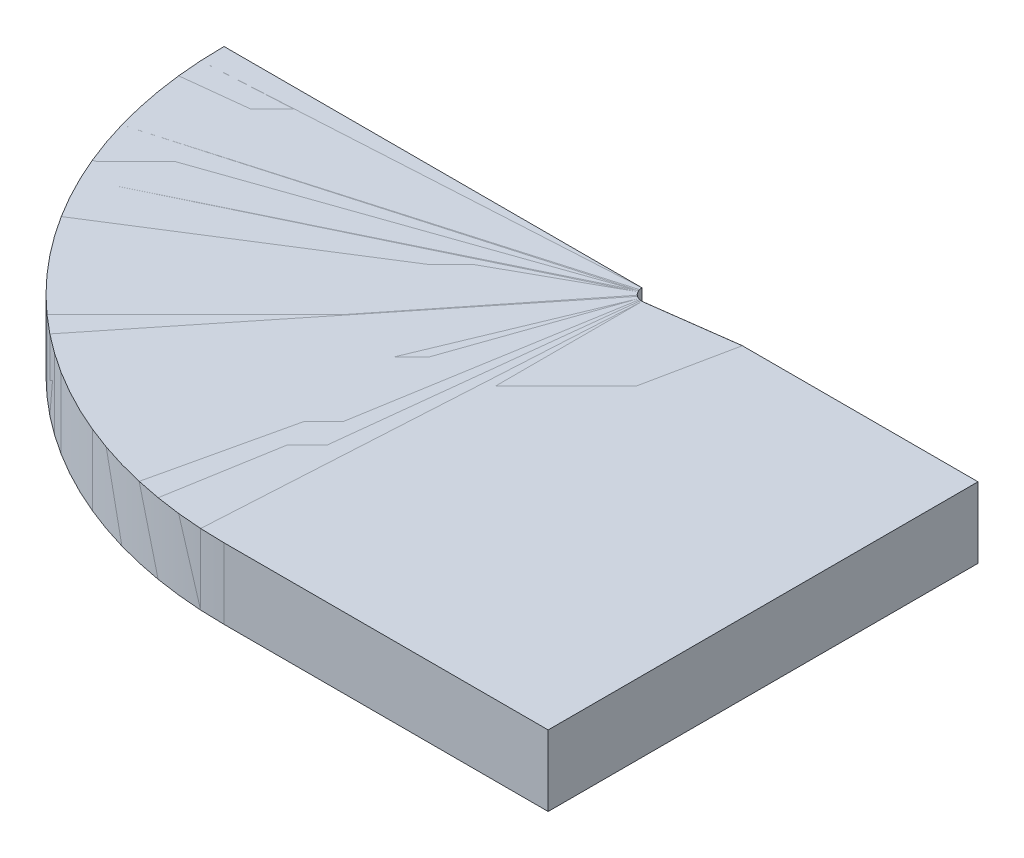
ISO-10303-21;
HEADER;
FILE_DESCRIPTION(('STEP AP214'),'2;1');
FILE_NAME('part.step','',(''),(''),'','','');
FILE_SCHEMA(('AUTOMOTIVE_DESIGN { 1 0 10303 214 1 1 1 1 }'));
ENDSEC;
DATA;
#1=APPLICATION_CONTEXT('core data for automotive mechanical design processes');
#2=APPLICATION_PROTOCOL_DEFINITION('international standard','automotive_design',2000,#1);
#3=PRODUCT_CONTEXT('',#1,'mechanical');
#4=PRODUCT('Part','Part','',(#3));
#5=PRODUCT_RELATED_PRODUCT_CATEGORY('part','',(#4));
#6=PRODUCT_DEFINITION_FORMATION('','',#4);
#7=PRODUCT_DEFINITION_CONTEXT('part definition',#1,'design');
#8=PRODUCT_DEFINITION('design','',#6,#7);
#9=PRODUCT_DEFINITION_SHAPE('','',#8);
#10=(LENGTH_UNIT() NAMED_UNIT(*) SI_UNIT(.MILLI.,.METRE.));
#11=(NAMED_UNIT(*) PLANE_ANGLE_UNIT() SI_UNIT($,.RADIAN.));
#12=(NAMED_UNIT(*) SI_UNIT($,.STERADIAN.) SOLID_ANGLE_UNIT());
#13=UNCERTAINTY_MEASURE_WITH_UNIT(LENGTH_MEASURE(1.E-05),#10,'distance_accuracy_value','');
#14=(GEOMETRIC_REPRESENTATION_CONTEXT(3) GLOBAL_UNCERTAINTY_ASSIGNED_CONTEXT((#13)) GLOBAL_UNIT_ASSIGNED_CONTEXT((#10,
#11,#12)) REPRESENTATION_CONTEXT('',''));
#15=CARTESIAN_POINT('',(0.,0.,0.));
#16=DIRECTION('',(0.,0.,1.));
#17=DIRECTION('',(1.,0.,0.));
#18=AXIS2_PLACEMENT_3D('',#15,#16,#17);
#19=CARTESIAN_POINT('',(35.85,0.,0.));
#20=DIRECTION('',(0.,1.,0.));
#21=DIRECTION('',(0.,0.,1.));
#22=AXIS2_PLACEMENT_3D('',#19,#20,#21);
#23=PLANE('',#22);
#24=CARTESIAN_POINT('',(35.85,0.,0.));
#25=DIRECTION('',(0.,1.,0.));
#26=DIRECTION('',(0.,0.,1.));
#27=AXIS2_PLACEMENT_3D('',#24,#25,#26);
#28=CIRCLE('',#27,1307.808);
#29=CARTESIAN_POINT('',(-1271.958,0.,-1.97456842843432E-13));
#30=VERTEX_POINT('',#29);
#31=CARTESIAN_POINT('',(35.8500000000003,0.,1307.808));
#32=VERTEX_POINT('',#31);
#33=EDGE_CURVE('E61',#30,#32,#28,.T.);
#34=ORIENTED_EDGE('',*,*,#33,.F.);
#35=DIRECTION('',(1.,0.,0.));
#36=VECTOR('',#35,1.);
#37=CARTESIAN_POINT('',(-1271.958,0.,-1.97456842843432E-13));
#38=LINE('',#37,#36);
#39=CARTESIAN_POINT('',(0.,0.,0.));
#40=VERTEX_POINT('',#39);
#41=EDGE_CURVE('E81',#30,#40,#38,.T.);
#42=ORIENTED_EDGE('',*,*,#41,.T.);
#43=CARTESIAN_POINT('',(35.85,0.,0.));
#44=DIRECTION('',(0.,1.,0.));
#45=DIRECTION('',(0.,0.,1.));
#46=AXIS2_PLACEMENT_3D('',#43,#44,#45);
#47=CIRCLE('',#46,35.8499999999999);
#48=CARTESIAN_POINT('',(35.85,0.,35.85));
#49=VERTEX_POINT('',#48);
#50=EDGE_CURVE('E86',#40,#49,#47,.T.);
#51=ORIENTED_EDGE('',*,*,#50,.T.);
#52=DIRECTION('',(0.991245582464698,0.,-0.132031038942446));
#53=VECTOR('',#52,1.);
#54=CARTESIAN_POINT('',(305.,0.,0.));
#55=LINE('',#54,#53);
#56=CARTESIAN_POINT('',(305.,0.,-1.97456842843432E-13));
#57=VERTEX_POINT('',#56);
#58=EDGE_CURVE('E91',#49,#57,#55,.T.);
#59=ORIENTED_EDGE('',*,*,#58,.T.);
#60=DIRECTION('',(1.,0.,0.));
#61=VECTOR('',#60,1.);
#62=CARTESIAN_POINT('',(35.85,0.,0.));
#63=LINE('',#62,#61);
#64=CARTESIAN_POINT('',(1022.0118,0.,0.));
#65=VERTEX_POINT('',#64);
#66=EDGE_CURVE('E96',#57,#65,#63,.T.);
#67=ORIENTED_EDGE('',*,*,#66,.T.);
#68=DIRECTION('',(0.,0.,-1.));
#69=VECTOR('',#68,1.);
#70=CARTESIAN_POINT('',(1022.0118,0.,-1307.808));
#71=LINE('',#70,#69);
#72=CARTESIAN_POINT('',(1022.0118,0.,1307.808));
#73=VERTEX_POINT('',#72);
#74=EDGE_CURVE('E57',#73,#65,#71,.T.);
#75=ORIENTED_EDGE('',*,*,#74,.F.);
#76=DIRECTION('',(1.,0.,0.));
#77=VECTOR('',#76,1.);
#78=CARTESIAN_POINT('',(305.,0.,1307.808));
#79=LINE('',#78,#77);
#80=EDGE_CURVE('E12',#32,#73,#79,.T.);
#81=ORIENTED_EDGE('',*,*,#80,.F.);
#82=EDGE_LOOP('',(#34,#42,#51,#59,#67,#75,#81));
#83=FACE_BOUND('',#82,.T.);
#84=ADVANCED_FACE('F52',(#83),#23,.F.);
#85=OPEN_SHELL('',(#84));
#86=SHELL_BASED_SURFACE_MODEL('B2',(#85));
#87=CARTESIAN_POINT('',(305.,0.,1307.808));
#88=DIRECTION('',(0.,0.,1.));
#89=DIRECTION('',(1.,0.,0.));
#90=AXIS2_PLACEMENT_3D('',#87,#88,#89);
#91=PLANE('',#90);
#92=DIRECTION('',(1.,0.,0.));
#93=VECTOR('',#92,1.);
#94=CARTESIAN_POINT('',(305.,0.,1307.808));
#95=LINE('',#94,#93);
#96=CARTESIAN_POINT('',(35.8500000000003,0.,1307.808));
#97=VERTEX_POINT('',#96);
#98=CARTESIAN_POINT('',(1022.0118,0.,1307.808));
#99=VERTEX_POINT('',#98);
#100=EDGE_CURVE('E142',#97,#99,#95,.T.);
#101=ORIENTED_EDGE('',*,*,#100,.T.);
#102=DIRECTION('',(0.,1.,0.));
#103=VECTOR('',#102,1.);
#104=CARTESIAN_POINT('',(1022.0118,0.,1307.808));
#105=LINE('',#104,#103);
#106=CARTESIAN_POINT('',(1022.0118,215.,1307.808));
#107=VERTEX_POINT('',#106);
#108=EDGE_CURVE('E153',#99,#107,#105,.T.);
#109=ORIENTED_EDGE('',*,*,#108,.T.);
#110=DIRECTION('',(1.,0.,0.));
#111=VECTOR('',#110,1.);
#112=CARTESIAN_POINT('',(35.85,215.,1307.808));
#113=LINE('',#112,#111);
#114=CARTESIAN_POINT('',(35.8500000000003,215.,1307.808));
#115=VERTEX_POINT('',#114);
#116=EDGE_CURVE('E138',#115,#107,#113,.T.);
#117=ORIENTED_EDGE('',*,*,#116,.F.);
#118=DIRECTION('',(0.,1.,0.));
#119=VECTOR('',#118,1.);
#120=CARTESIAN_POINT('',(35.8500000000003,0.,1307.808));
#121=LINE('',#120,#119);
#122=EDGE_CURVE('E50',#97,#115,#121,.T.);
#123=ORIENTED_EDGE('',*,*,#122,.F.);
#124=EDGE_LOOP('',(#101,#109,#117,#123));
#125=FACE_BOUND('',#124,.T.);
#126=ADVANCED_FACE('F133',(#125),#91,.T.);
#127=OPEN_SHELL('',(#126));
#128=SHELL_BASED_SURFACE_MODEL('B6',(#127));
#129=CARTESIAN_POINT('',(1022.0118,0.,-1307.808));
#130=DIRECTION('',(1.,0.,0.));
#131=DIRECTION('',(0.,0.,-1.));
#132=AXIS2_PLACEMENT_3D('',#129,#130,#131);
#133=PLANE('',#132);
#134=DIRECTION('',(0.,1.,0.));
#135=VECTOR('',#134,1.);
#136=CARTESIAN_POINT('',(1022.0118,0.,-1.97456842843432E-13));
#137=LINE('',#136,#135);
#138=CARTESIAN_POINT('',(1022.0118,0.,0.));
#139=VERTEX_POINT('',#138);
#140=CARTESIAN_POINT('',(1022.0118,215.,-1.97456842843432E-13));
#141=VERTEX_POINT('',#140);
#142=EDGE_CURVE('E196',#139,#141,#137,.T.);
#143=ORIENTED_EDGE('',*,*,#142,.T.);
#144=DIRECTION('',(0.,0.,1.));
#145=VECTOR('',#144,1.);
#146=CARTESIAN_POINT('',(1022.0118,215.,0.));
#147=LINE('',#146,#145);
#148=CARTESIAN_POINT('',(1022.0118,215.,1307.808));
#149=VERTEX_POINT('',#148);
#150=EDGE_CURVE('E207',#149,#141,#147,.F.);
#151=ORIENTED_EDGE('',*,*,#150,.F.);
#152=DIRECTION('',(0.,1.,0.));
#153=VECTOR('',#152,1.);
#154=CARTESIAN_POINT('',(1022.0118,0.,1307.808));
#155=LINE('',#154,#153);
#156=CARTESIAN_POINT('',(1022.0118,0.,1307.808));
#157=VERTEX_POINT('',#156);
#158=EDGE_CURVE('E192',#157,#149,#155,.T.);
#159=ORIENTED_EDGE('',*,*,#158,.F.);
#160=DIRECTION('',(0.,0.,-1.));
#161=VECTOR('',#160,1.);
#162=CARTESIAN_POINT('',(1022.0118,0.,-1307.808));
#163=LINE('',#162,#161);
#164=EDGE_CURVE('E131',#157,#139,#163,.T.);
#165=ORIENTED_EDGE('',*,*,#164,.T.);
#166=EDGE_LOOP('',(#143,#151,#159,#165));
#167=FACE_BOUND('',#166,.T.);
#168=ADVANCED_FACE('F187',(#167),#133,.T.);
#169=OPEN_SHELL('',(#168));
#170=SHELL_BASED_SURFACE_MODEL('B44',(#169));
#171=CARTESIAN_POINT('',(35.85,215.,0.));
#172=DIRECTION('',(0.,1.,0.));
#173=DIRECTION('',(0.,0.,1.));
#174=AXIS2_PLACEMENT_3D('',#171,#172,#173);
#175=PLANE('',#174);
#176=DIRECTION('',(1.,0.,0.));
#177=VECTOR('',#176,1.);
#178=CARTESIAN_POINT('',(-1271.958,215.,-1.97456842843432E-13));
#179=LINE('',#178,#177);
#180=CARTESIAN_POINT('',(-1271.958,215.,-1.97456842843432E-13));
#181=VERTEX_POINT('',#180);
#182=CARTESIAN_POINT('',(0.,215.,-1.97456842843432E-13));
#183=VERTEX_POINT('',#182);
#184=EDGE_CURVE('E250',#181,#183,#179,.T.);
#185=ORIENTED_EDGE('',*,*,#184,.F.);
#186=CARTESIAN_POINT('',(35.85,215.,0.));
#187=DIRECTION('',(0.,1.,0.));
#188=DIRECTION('',(0.,0.,1.));
#189=AXIS2_PLACEMENT_3D('',#186,#187,#188);
#190=CIRCLE('',#189,1307.808);
#191=CARTESIAN_POINT('',(35.8500000000003,215.,1307.808));
#192=VERTEX_POINT('',#191);
#193=EDGE_CURVE('E270',#181,#192,#190,.T.);
#194=ORIENTED_EDGE('',*,*,#193,.T.);
#195=DIRECTION('',(1.,0.,0.));
#196=VECTOR('',#195,1.);
#197=CARTESIAN_POINT('',(35.85,215.,1307.808));
#198=LINE('',#197,#196);
#199=CARTESIAN_POINT('',(1022.0118,215.,1307.808));
#200=VERTEX_POINT('',#199);
#201=EDGE_CURVE('E276',#192,#200,#198,.T.);
#202=ORIENTED_EDGE('',*,*,#201,.T.);
#203=DIRECTION('',(0.,0.,1.));
#204=VECTOR('',#203,1.);
#205=CARTESIAN_POINT('',(1022.0118,215.,0.));
#206=LINE('',#205,#204);
#207=CARTESIAN_POINT('',(1022.0118,215.,-1.97456842843432E-13));
#208=VERTEX_POINT('',#207);
#209=EDGE_CURVE('E281',#200,#208,#206,.F.);
#210=ORIENTED_EDGE('',*,*,#209,.T.);
#211=CARTESIAN_POINT('',(305.,215.,-1.97456842843432E-13));
#212=VERTEX_POINT('',#211);
#213=EDGE_CURVE('E274',#212,#208,#179,.T.);
#214=ORIENTED_EDGE('',*,*,#213,.F.);
#215=DIRECTION('',(0.991245582464698,0.,-0.132031038942446));
#216=VECTOR('',#215,1.);
#217=CARTESIAN_POINT('',(305.,215.,0.));
#218=LINE('',#217,#216);
#219=CARTESIAN_POINT('',(35.8500000000004,215.,35.8499999999999));
#220=VERTEX_POINT('',#219);
#221=EDGE_CURVE('E246',#220,#212,#218,.T.);
#222=ORIENTED_EDGE('',*,*,#221,.F.);
#223=CARTESIAN_POINT('',(35.85,215.,0.));
#224=DIRECTION('',(0.,1.,0.));
#225=DIRECTION('',(0.,0.,1.));
#226=AXIS2_PLACEMENT_3D('',#223,#224,#225);
#227=CIRCLE('',#226,35.8499999999999);
#228=EDGE_CURVE('E185',#183,#220,#227,.T.);
#229=ORIENTED_EDGE('',*,*,#228,.F.);
#230=EDGE_LOOP('',(#185,#194,#202,#210,#214,#222,#229));
#231=FACE_BOUND('',#230,.T.);
#232=ADVANCED_FACE('F241',(#231),#175,.T.);
#233=OPEN_SHELL('',(#232));
#234=SHELL_BASED_SURFACE_MODEL('B125',(#233));
#235=CARTESIAN_POINT('',(35.85,0.,0.));
#236=DIRECTION('',(0.,1.,0.));
#237=DIRECTION('',(0.,0.,1.));
#238=AXIS2_PLACEMENT_3D('',#235,#236,#237);
#239=CYLINDRICAL_SURFACE('',#238,1307.808);
#240=DIRECTION('',(0.,1.,0.));
#241=VECTOR('',#240,1.);
#242=CARTESIAN_POINT('',(-1271.958,0.,-1.97456842843432E-13));
#243=LINE('',#242,#241);
#244=CARTESIAN_POINT('',(-1271.958,0.,-1.97456842843432E-13));
#245=VERTEX_POINT('',#244);
#246=CARTESIAN_POINT('',(-1271.958,215.,-1.97456842843432E-13));
#247=VERTEX_POINT('',#246);
#248=EDGE_CURVE('E330',#245,#247,#243,.T.);
#249=ORIENTED_EDGE('',*,*,#248,.F.);
#250=CARTESIAN_POINT('',(35.85,0.,0.));
#251=DIRECTION('',(0.,1.,0.));
#252=DIRECTION('',(0.,0.,1.));
#253=AXIS2_PLACEMENT_3D('',#250,#251,#252);
#254=CIRCLE('',#253,1307.808);
#255=CARTESIAN_POINT('',(35.8500000000003,0.,1307.808));
#256=VERTEX_POINT('',#255);
#257=EDGE_CURVE('E341',#245,#256,#254,.T.);
#258=ORIENTED_EDGE('',*,*,#257,.T.);
#259=DIRECTION('',(0.,1.,0.));
#260=VECTOR('',#259,1.);
#261=CARTESIAN_POINT('',(35.8500000000003,0.,1307.808));
#262=LINE('',#261,#260);
#263=CARTESIAN_POINT('',(35.8500000000003,215.,1307.808));
#264=VERTEX_POINT('',#263);
#265=EDGE_CURVE('E326',#256,#264,#262,.T.);
#266=ORIENTED_EDGE('',*,*,#265,.T.);
#267=CARTESIAN_POINT('',(35.85,215.,0.));
#268=DIRECTION('',(0.,1.,0.));
#269=DIRECTION('',(0.,0.,1.));
#270=AXIS2_PLACEMENT_3D('',#267,#268,#269);
#271=CIRCLE('',#270,1307.808);
#272=EDGE_CURVE('E239',#247,#264,#271,.T.);
#273=ORIENTED_EDGE('',*,*,#272,.F.);
#274=EDGE_LOOP('',(#249,#258,#266,#273));
#275=FACE_BOUND('',#274,.T.);
#276=ADVANCED_FACE('F321',(#275),#239,.T.);
#277=OPEN_SHELL('',(#276));
#278=SHELL_BASED_SURFACE_MODEL('B179',(#277));
#279=CARTESIAN_POINT('',(-1271.958,0.,-1.97456842843432E-13));
#280=DIRECTION('',(0.,0.,1.));
#281=DIRECTION('',(1.,0.,0.));
#282=AXIS2_PLACEMENT_3D('',#279,#280,#281);
#283=PLANE('',#282);
#284=DIRECTION('',(0.,1.,0.));
#285=VECTOR('',#284,1.);
#286=CARTESIAN_POINT('',(305.,0.,0.));
#287=LINE('',#286,#285);
#288=CARTESIAN_POINT('',(305.,0.,-1.97456842843432E-13));
#289=VERTEX_POINT('',#288);
#290=CARTESIAN_POINT('',(305.,215.,-1.97456842843432E-13));
#291=VERTEX_POINT('',#290);
#292=EDGE_CURVE('E319',#289,#291,#287,.T.);
#293=ORIENTED_EDGE('',*,*,#292,.T.);
#294=DIRECTION('',(1.,0.,0.));
#295=VECTOR('',#294,1.);
#296=CARTESIAN_POINT('',(-1271.958,215.,-1.97456842843432E-13));
#297=LINE('',#296,#295);
#298=CARTESIAN_POINT('',(1022.0118,215.,-1.97456842843432E-13));
#299=VERTEX_POINT('',#298);
#300=EDGE_CURVE('E376',#291,#299,#297,.T.);
#301=ORIENTED_EDGE('',*,*,#300,.T.);
#302=DIRECTION('',(0.,1.,0.));
#303=VECTOR('',#302,1.);
#304=CARTESIAN_POINT('',(1022.0118,0.,-1.97456842843432E-13));
#305=LINE('',#304,#303);
#306=CARTESIAN_POINT('',(1022.0118,0.,0.));
#307=VERTEX_POINT('',#306);
#308=EDGE_CURVE('E395',#307,#299,#305,.T.);
#309=ORIENTED_EDGE('',*,*,#308,.F.);
#310=DIRECTION('',(1.,0.,0.));
#311=VECTOR('',#310,1.);
#312=CARTESIAN_POINT('',(35.85,0.,0.));
#313=LINE('',#312,#311);
#314=EDGE_CURVE('E394',#289,#307,#313,.T.);
#315=ORIENTED_EDGE('',*,*,#314,.F.);
#316=EDGE_LOOP('',(#293,#301,#309,#315));
#317=FACE_BOUND('',#316,.T.);
#318=ADVANCED_FACE('F375',(#317),#283,.F.);
#319=OPEN_SHELL('',(#318));
#320=SHELL_BASED_SURFACE_MODEL('B233',(#319));
#321=CARTESIAN_POINT('',(-1271.958,0.,-1.97456842843432E-13));
#322=DIRECTION('',(0.,0.,1.));
#323=DIRECTION('',(1.,0.,0.));
#324=AXIS2_PLACEMENT_3D('',#321,#322,#323);
#325=PLANE('',#324);
#326=DIRECTION('',(0.,1.,0.));
#327=VECTOR('',#326,1.);
#328=CARTESIAN_POINT('',(0.,0.,-1.97456842843432E-13));
#329=LINE('',#328,#327);
#330=CARTESIAN_POINT('',(0.,215.,-1.97456842843432E-13));
#331=VERTEX_POINT('',#330);
#332=CARTESIAN_POINT('',(0.,0.,0.));
#333=VERTEX_POINT('',#332);
#334=EDGE_CURVE('E439',#331,#333,#329,.F.);
#335=ORIENTED_EDGE('',*,*,#334,.T.);
#336=DIRECTION('',(1.,0.,0.));
#337=VECTOR('',#336,1.);
#338=CARTESIAN_POINT('',(-1271.958,0.,-1.97456842843432E-13));
#339=LINE('',#338,#337);
#340=CARTESIAN_POINT('',(-1271.958,0.,-1.97456842843432E-13));
#341=VERTEX_POINT('',#340);
#342=EDGE_CURVE('E450',#341,#333,#339,.T.);
#343=ORIENTED_EDGE('',*,*,#342,.F.);
#344=DIRECTION('',(0.,1.,0.));
#345=VECTOR('',#344,1.);
#346=CARTESIAN_POINT('',(-1271.958,0.,-1.97456842843432E-13));
#347=LINE('',#346,#345);
#348=CARTESIAN_POINT('',(-1271.958,215.,-1.97456842843432E-13));
#349=VERTEX_POINT('',#348);
#350=EDGE_CURVE('E430',#341,#349,#347,.T.);
#351=ORIENTED_EDGE('',*,*,#350,.T.);
#352=DIRECTION('',(1.,0.,0.));
#353=VECTOR('',#352,1.);
#354=CARTESIAN_POINT('',(-1271.958,215.,-1.97456842843432E-13));
#355=LINE('',#354,#353);
#356=EDGE_CURVE('E373',#349,#331,#355,.T.);
#357=ORIENTED_EDGE('',*,*,#356,.T.);
#358=EDGE_LOOP('',(#335,#343,#351,#357));
#359=FACE_BOUND('',#358,.T.);
#360=ADVANCED_FACE('F429',(#359),#325,.F.);
#361=OPEN_SHELL('',(#360));
#362=SHELL_BASED_SURFACE_MODEL('B313',(#361));
#363=CARTESIAN_POINT('',(1022.0118,0.,-1307.808));
#364=DIRECTION('',(1.,0.,0.));
#365=DIRECTION('',(0.,0.,-1.));
#366=AXIS2_PLACEMENT_3D('',#363,#364,#365);
#367=PLANE('',#366);
#368=DIRECTION('',(0.,1.,0.));
#369=VECTOR('',#368,1.);
#370=CARTESIAN_POINT('',(1022.0118,0.,-1.97456842843432E-13));
#371=LINE('',#370,#369);
#372=CARTESIAN_POINT('',(1022.0118,0.,0.));
#373=VERTEX_POINT('',#372);
#374=CARTESIAN_POINT('',(1022.0118,215.,-1.97456842843432E-13));
#375=VERTEX_POINT('',#374);
#376=EDGE_CURVE('E496',#373,#375,#371,.T.);
#377=ORIENTED_EDGE('',*,*,#376,.T.);
#378=DIRECTION('',(0.,0.,1.));
#379=VECTOR('',#378,1.);
#380=CARTESIAN_POINT('',(1022.0118,215.,0.));
#381=LINE('',#380,#379);
#382=CARTESIAN_POINT('',(1022.0118,215.,1307.808));
#383=VERTEX_POINT('',#382);
#384=EDGE_CURVE('E575',#383,#375,#381,.F.);
#385=ORIENTED_EDGE('',*,*,#384,.F.);
#386=DIRECTION('',(0.,1.,0.));
#387=VECTOR('',#386,1.);
#388=CARTESIAN_POINT('',(1022.0118,0.,1307.808));
#389=LINE('',#388,#387);
#390=CARTESIAN_POINT('',(1022.0118,0.,1307.808));
#391=VERTEX_POINT('',#390);
#392=EDGE_CURVE('E489',#391,#383,#389,.T.);
#393=ORIENTED_EDGE('',*,*,#392,.F.);
#394=DIRECTION('',(0.,0.,-1.));
#395=VECTOR('',#394,1.);
#396=CARTESIAN_POINT('',(1022.0118,0.,-1307.808));
#397=LINE('',#396,#395);
#398=EDGE_CURVE('E561',#391,#373,#397,.T.);
#399=ORIENTED_EDGE('',*,*,#398,.T.);
#400=EDGE_LOOP('',(#377,#385,#393,#399));
#401=FACE_BOUND('',#400,.T.);
#402=ADVANCED_FACE('F481',(#401),#367,.T.);
#403=CARTESIAN_POINT('',(35.85,0.,0.));
#404=DIRECTION('',(0.,1.,0.));
#405=DIRECTION('',(0.,0.,1.));
#406=AXIS2_PLACEMENT_3D('',#403,#404,#405);
#407=CYLINDRICAL_SURFACE('',#406,1307.808);
#408=DIRECTION('',(0.,1.,0.));
#409=VECTOR('',#408,1.);
#410=CARTESIAN_POINT('',(-1271.958,0.,-1.97456842843432E-13));
#411=LINE('',#410,#409);
#412=CARTESIAN_POINT('',(-1271.958,0.,-1.97456842843432E-13));
#413=VERTEX_POINT('',#412);
#414=CARTESIAN_POINT('',(-1271.958,215.,-1.97456842843432E-13));
#415=VERTEX_POINT('',#414);
#416=EDGE_CURVE('E539',#413,#415,#411,.T.);
#417=ORIENTED_EDGE('',*,*,#416,.F.);
#418=CARTESIAN_POINT('',(35.85,0.,0.));
#419=DIRECTION('',(0.,1.,0.));
#420=DIRECTION('',(0.,0.,1.));
#421=AXIS2_PLACEMENT_3D('',#418,#419,#420);
#422=CIRCLE('',#421,1307.808);
#423=CARTESIAN_POINT('',(35.8500000000003,0.,1307.808));
#424=VERTEX_POINT('',#423);
#425=EDGE_CURVE('E550',#413,#424,#422,.T.);
#426=ORIENTED_EDGE('',*,*,#425,.T.);
#427=DIRECTION('',(0.,1.,0.));
#428=VECTOR('',#427,1.);
#429=CARTESIAN_POINT('',(35.8500000000003,0.,1307.808));
#430=LINE('',#429,#428);
#431=CARTESIAN_POINT('',(35.8500000000003,215.,1307.808));
#432=VERTEX_POINT('',#431);
#433=EDGE_CURVE('E577',#424,#432,#430,.T.);
#434=ORIENTED_EDGE('',*,*,#433,.T.);
#435=CARTESIAN_POINT('',(35.85,215.,0.));
#436=DIRECTION('',(0.,1.,0.));
#437=DIRECTION('',(0.,0.,1.));
#438=AXIS2_PLACEMENT_3D('',#435,#436,#437);
#439=CIRCLE('',#438,1307.808);
#440=EDGE_CURVE('E552',#415,#432,#439,.T.);
#441=ORIENTED_EDGE('',*,*,#440,.F.);
#442=EDGE_LOOP('',(#417,#426,#434,#441));
#443=FACE_BOUND('',#442,.T.);
#444=ADVANCED_FACE('F548',(#443),#407,.T.);
#445=CARTESIAN_POINT('',(305.,0.,0.));
#446=DIRECTION('',(0.132031038942446,0.,0.991245582464698));
#447=DIRECTION('',(0.991245582464698,0.,-0.132031038942446));
#448=AXIS2_PLACEMENT_3D('',#445,#446,#447);
#449=PLANE('',#448);
#450=DIRECTION('',(0.,1.,0.));
#451=VECTOR('',#450,1.);
#452=CARTESIAN_POINT('',(305.,0.,0.));
#453=LINE('',#452,#451);
#454=CARTESIAN_POINT('',(305.,0.,-1.97456842843432E-13));
#455=VERTEX_POINT('',#454);
#456=CARTESIAN_POINT('',(305.,215.,-1.97456842843432E-13));
#457=VERTEX_POINT('',#456);
#458=EDGE_CURVE('E574',#455,#457,#453,.T.);
#459=ORIENTED_EDGE('',*,*,#458,.F.);
#460=DIRECTION('',(0.991245582464698,0.,-0.132031038942446));
#461=VECTOR('',#460,1.);
#462=CARTESIAN_POINT('',(305.,0.,0.));
#463=LINE('',#462,#461);
#464=CARTESIAN_POINT('',(35.85,0.,35.85));
#465=VERTEX_POINT('',#464);
#466=EDGE_CURVE('E559',#465,#455,#463,.T.);
#467=ORIENTED_EDGE('',*,*,#466,.F.);
#468=DIRECTION('',(0.,1.,0.));
#469=VECTOR('',#468,1.);
#470=CARTESIAN_POINT('',(35.85,0.,35.85));
#471=LINE('',#470,#469);
#472=CARTESIAN_POINT('',(35.8500000000004,215.,35.8499999999999));
#473=VERTEX_POINT('',#472);
#474=EDGE_CURVE('E571',#465,#473,#471,.T.);
#475=ORIENTED_EDGE('',*,*,#474,.T.);
#476=DIRECTION('',(0.991245582464698,0.,-0.132031038942446));
#477=VECTOR('',#476,1.);
#478=CARTESIAN_POINT('',(305.,215.,0.));
#479=LINE('',#478,#477);
#480=EDGE_CURVE('E587',#473,#457,#479,.T.);
#481=ORIENTED_EDGE('',*,*,#480,.T.);
#482=EDGE_LOOP('',(#459,#467,#475,#481));
#483=FACE_BOUND('',#482,.T.);
#484=ADVANCED_FACE('F598',(#483),#449,.F.);
#485=CARTESIAN_POINT('',(35.85,0.,0.));
#486=DIRECTION('',(0.,1.,0.));
#487=DIRECTION('',(0.,0.,1.));
#488=AXIS2_PLACEMENT_3D('',#485,#486,#487);
#489=CYLINDRICAL_SURFACE('',#488,35.8499999999999);
#490=DIRECTION('',(0.,1.,0.));
#491=VECTOR('',#490,1.);
#492=CARTESIAN_POINT('',(0.,0.,-1.97456842843432E-13));
#493=LINE('',#492,#491);
#494=CARTESIAN_POINT('',(0.,215.,-1.97456842843432E-13));
#495=VERTEX_POINT('',#494);
#496=CARTESIAN_POINT('',(0.,0.,0.));
#497=VERTEX_POINT('',#496);
#498=EDGE_CURVE('E503',#495,#497,#493,.F.);
#499=ORIENTED_EDGE('',*,*,#498,.F.);
#500=CARTESIAN_POINT('',(35.85,215.,0.));
#501=DIRECTION('',(0.,1.,0.));
#502=DIRECTION('',(0.,0.,1.));
#503=AXIS2_PLACEMENT_3D('',#500,#501,#502);
#504=CIRCLE('',#503,35.8499999999999);
#505=EDGE_CURVE('E570',#495,#473,#504,.T.);
#506=ORIENTED_EDGE('',*,*,#505,.T.);
#507=ORIENTED_EDGE('',*,*,#474,.F.);
#508=CARTESIAN_POINT('',(35.85,0.,0.));
#509=DIRECTION('',(0.,1.,0.));
#510=DIRECTION('',(0.,0.,1.));
#511=AXIS2_PLACEMENT_3D('',#508,#509,#510);
#512=CIRCLE('',#511,35.8499999999999);
#513=EDGE_CURVE('E564',#497,#465,#512,.T.);
#514=ORIENTED_EDGE('',*,*,#513,.F.);
#515=EDGE_LOOP('',(#499,#506,#507,#514));
#516=FACE_BOUND('',#515,.T.);
#517=ADVANCED_FACE('F606',(#516),#489,.F.);
#518=CARTESIAN_POINT('',(305.,0.,1307.808));
#519=DIRECTION('',(0.,0.,1.));
#520=DIRECTION('',(1.,0.,0.));
#521=AXIS2_PLACEMENT_3D('',#518,#519,#520);
#522=PLANE('',#521);
#523=DIRECTION('',(1.,0.,0.));
#524=VECTOR('',#523,1.);
#525=CARTESIAN_POINT('',(305.,0.,1307.808));
#526=LINE('',#525,#524);
#527=EDGE_CURVE('E558',#424,#391,#526,.T.);
#528=ORIENTED_EDGE('',*,*,#527,.T.);
#529=ORIENTED_EDGE('',*,*,#392,.T.);
#530=DIRECTION('',(1.,0.,0.));
#531=VECTOR('',#530,1.);
#532=CARTESIAN_POINT('',(35.85,215.,1307.808));
#533=LINE('',#532,#531);
#534=EDGE_CURVE('E581',#432,#383,#533,.T.);
#535=ORIENTED_EDGE('',*,*,#534,.F.);
#536=ORIENTED_EDGE('',*,*,#433,.F.);
#537=EDGE_LOOP('',(#528,#529,#535,#536));
#538=FACE_BOUND('',#537,.T.);
#539=ADVANCED_FACE('F483',(#538),#522,.T.);
#540=CARTESIAN_POINT('',(35.85,215.,0.));
#541=DIRECTION('',(0.,1.,0.));
#542=DIRECTION('',(0.,0.,1.));
#543=AXIS2_PLACEMENT_3D('',#540,#541,#542);
#544=PLANE('',#543);
#545=DIRECTION('',(1.,0.,0.));
#546=VECTOR('',#545,1.);
#547=CARTESIAN_POINT('',(-1271.958,215.,-1.97456842843432E-13));
#548=LINE('',#547,#546);
#549=EDGE_CURVE('E544',#415,#495,#548,.T.);
#550=ORIENTED_EDGE('',*,*,#549,.F.);
#551=ORIENTED_EDGE('',*,*,#440,.T.);
#552=ORIENTED_EDGE('',*,*,#534,.T.);
#553=ORIENTED_EDGE('',*,*,#384,.T.);
#554=EDGE_CURVE('E603',#457,#375,#548,.T.);
#555=ORIENTED_EDGE('',*,*,#554,.F.);
#556=ORIENTED_EDGE('',*,*,#480,.F.);
#557=ORIENTED_EDGE('',*,*,#505,.F.);
#558=EDGE_LOOP('',(#550,#551,#552,#553,#555,#556,#557));
#559=FACE_BOUND('',#558,.T.);
#560=ADVANCED_FACE('F602',(#559),#544,.T.);
#561=CARTESIAN_POINT('',(35.85,0.,0.));
#562=DIRECTION('',(0.,1.,0.));
#563=DIRECTION('',(0.,0.,1.));
#564=AXIS2_PLACEMENT_3D('',#561,#562,#563);
#565=PLANE('',#564);
#566=ORIENTED_EDGE('',*,*,#425,.F.);
#567=DIRECTION('',(1.,0.,0.));
#568=VECTOR('',#567,1.);
#569=CARTESIAN_POINT('',(-1271.958,0.,-1.97456842843432E-13));
#570=LINE('',#569,#568);
#571=EDGE_CURVE('E536',#413,#497,#570,.T.);
#572=ORIENTED_EDGE('',*,*,#571,.T.);
#573=ORIENTED_EDGE('',*,*,#513,.T.);
#574=ORIENTED_EDGE('',*,*,#466,.T.);
#575=DIRECTION('',(1.,0.,0.));
#576=VECTOR('',#575,1.);
#577=CARTESIAN_POINT('',(35.85,0.,0.));
#578=LINE('',#577,#576);
#579=EDGE_CURVE('E427',#455,#373,#578,.T.);
#580=ORIENTED_EDGE('',*,*,#579,.T.);
#581=ORIENTED_EDGE('',*,*,#398,.F.);
#582=ORIENTED_EDGE('',*,*,#527,.F.);
#583=EDGE_LOOP('',(#566,#572,#573,#574,#580,#581,#582));
#584=FACE_BOUND('',#583,.T.);
#585=ADVANCED_FACE('F555',(#584),#565,.F.);
#586=CARTESIAN_POINT('',(-1271.958,0.,-1.97456842843432E-13));
#587=DIRECTION('',(0.,0.,1.));
#588=DIRECTION('',(1.,0.,0.));
#589=AXIS2_PLACEMENT_3D('',#586,#587,#588);
#590=PLANE('',#589);
#591=ORIENTED_EDGE('',*,*,#458,.T.);
#592=ORIENTED_EDGE('',*,*,#554,.T.);
#593=ORIENTED_EDGE('',*,*,#376,.F.);
#594=ORIENTED_EDGE('',*,*,#579,.F.);
#595=EDGE_LOOP('',(#591,#592,#593,#594));
#596=FACE_BOUND('',#595,.T.);
#597=ADVANCED_FACE('F620',(#596),#590,.F.);
#598=ORIENTED_EDGE('',*,*,#498,.T.);
#599=ORIENTED_EDGE('',*,*,#571,.F.);
#600=ORIENTED_EDGE('',*,*,#416,.T.);
#601=ORIENTED_EDGE('',*,*,#549,.T.);
#602=EDGE_LOOP('',(#598,#599,#600,#601));
#603=FACE_BOUND('',#602,.T.);
#604=ADVANCED_FACE('F538',(#603),#590,.F.);
#605=CLOSED_SHELL('',(#402,#444,#484,#517,#539,#560,#585,#597,#604));
#606=MANIFOLD_SOLID_BREP('B367',#605);
#607=CARTESIAN_POINT('',(35.85,0.,0.));
#608=DIRECTION('',(0.,1.,0.));
#609=DIRECTION('',(0.,0.,1.));
#610=AXIS2_PLACEMENT_3D('',#607,#608,#609);
#611=CYLINDRICAL_SURFACE('',#610,35.85);
#612=DIRECTION('',(0.,1.,0.));
#613=VECTOR('',#612,1.);
#614=CARTESIAN_POINT('',(35.85,0.,35.85));
#615=LINE('',#614,#613);
#616=CARTESIAN_POINT('',(35.85,0.,35.85));
#617=VERTEX_POINT('',#616);
#618=CARTESIAN_POINT('',(35.85,215.1,35.85));
#619=VERTEX_POINT('',#618);
#620=EDGE_CURVE('E713',#617,#619,#615,.T.);
#621=ORIENTED_EDGE('',*,*,#620,.T.);
#622=CARTESIAN_POINT('',(35.85,215.1,0.));
#623=DIRECTION('',(0.,1.,0.));
#624=DIRECTION('',(0.,0.,1.));
#625=AXIS2_PLACEMENT_3D('',#622,#623,#624);
#626=CIRCLE('',#625,35.85);
#627=CARTESIAN_POINT('',(0.,215.1,0.));
#628=VERTEX_POINT('',#627);
#629=EDGE_CURVE('E684',#619,#628,#626,.F.);
#630=ORIENTED_EDGE('',*,*,#629,.T.);
#631=DIRECTION('',(0.,1.,0.));
#632=VECTOR('',#631,1.);
#633=CARTESIAN_POINT('',(0.,0.,0.));
#634=LINE('',#633,#632);
#635=CARTESIAN_POINT('',(0.,0.,0.));
#636=VERTEX_POINT('',#635);
#637=EDGE_CURVE('E725',#636,#628,#634,.T.);
#638=ORIENTED_EDGE('',*,*,#637,.F.);
#639=CARTESIAN_POINT('',(35.85,0.,0.));
#640=DIRECTION('',(0.,1.,0.));
#641=DIRECTION('',(0.,0.,1.));
#642=AXIS2_PLACEMENT_3D('',#639,#640,#641);
#643=CIRCLE('',#642,35.85);
#644=EDGE_CURVE('E724',#636,#617,#643,.T.);
#645=ORIENTED_EDGE('',*,*,#644,.T.);
#646=EDGE_LOOP('',(#621,#630,#638,#645));
#647=FACE_BOUND('',#646,.T.);
#648=ADVANCED_FACE('F681',(#647),#611,.T.);
#649=CARTESIAN_POINT('',(305.,0.,0.));
#650=DIRECTION('',(0.132031038942446,0.,0.991245582464698));
#651=DIRECTION('',(0.991245582464698,0.,-0.132031038942446));
#652=AXIS2_PLACEMENT_3D('',#649,#650,#651);
#653=PLANE('',#652);
#654=DIRECTION('',(0.,1.,0.));
#655=VECTOR('',#654,1.);
#656=CARTESIAN_POINT('',(305.,0.,0.));
#657=LINE('',#656,#655);
#658=CARTESIAN_POINT('',(305.,0.,0.));
#659=VERTEX_POINT('',#658);
#660=CARTESIAN_POINT('',(305.,215.1,0.));
#661=VERTEX_POINT('',#660);
#662=EDGE_CURVE('E695',#659,#661,#657,.T.);
#663=ORIENTED_EDGE('',*,*,#662,.T.);
#664=DIRECTION('',(-0.991245582464698,0.,0.132031038942446));
#665=VECTOR('',#664,1.);
#666=CARTESIAN_POINT('',(305.,215.1,0.));
#667=LINE('',#666,#665);
#668=EDGE_CURVE('E479',#661,#619,#667,.T.);
#669=ORIENTED_EDGE('',*,*,#668,.T.);
#670=ORIENTED_EDGE('',*,*,#620,.F.);
#671=DIRECTION('',(0.991245582464698,0.,-0.132031038942446));
#672=VECTOR('',#671,1.);
#673=CARTESIAN_POINT('',(305.,0.,0.));
#674=LINE('',#673,#672);
#675=EDGE_CURVE('E711',#617,#659,#674,.T.);
#676=ORIENTED_EDGE('',*,*,#675,.T.);
#677=EDGE_LOOP('',(#663,#669,#670,#676));
#678=FACE_BOUND('',#677,.T.);
#679=ADVANCED_FACE('F682',(#678),#653,.T.);
#680=OPEN_SHELL('',(#648,#679));
#681=SHELL_BASED_SURFACE_MODEL('B421',(#680));
#682=ADVANCED_BREP_SHAPE_REPRESENTATION('',(#18,#606),#14);
#683=MANIFOLD_SURFACE_SHAPE_REPRESENTATION('',(#18,#86,#128,#170,#234,#278,#320,#362,#681),#14);
#684=SHAPE_REPRESENTATION('',(#18),#14);
#685=SHAPE_DEFINITION_REPRESENTATION(#9,#684);
#686=SHAPE_REPRESENTATION_RELATIONSHIP('','',#684,#682);
#687=SHAPE_REPRESENTATION_RELATIONSHIP('','',#684,#683);
ENDSEC;
END-ISO-10303-21;
